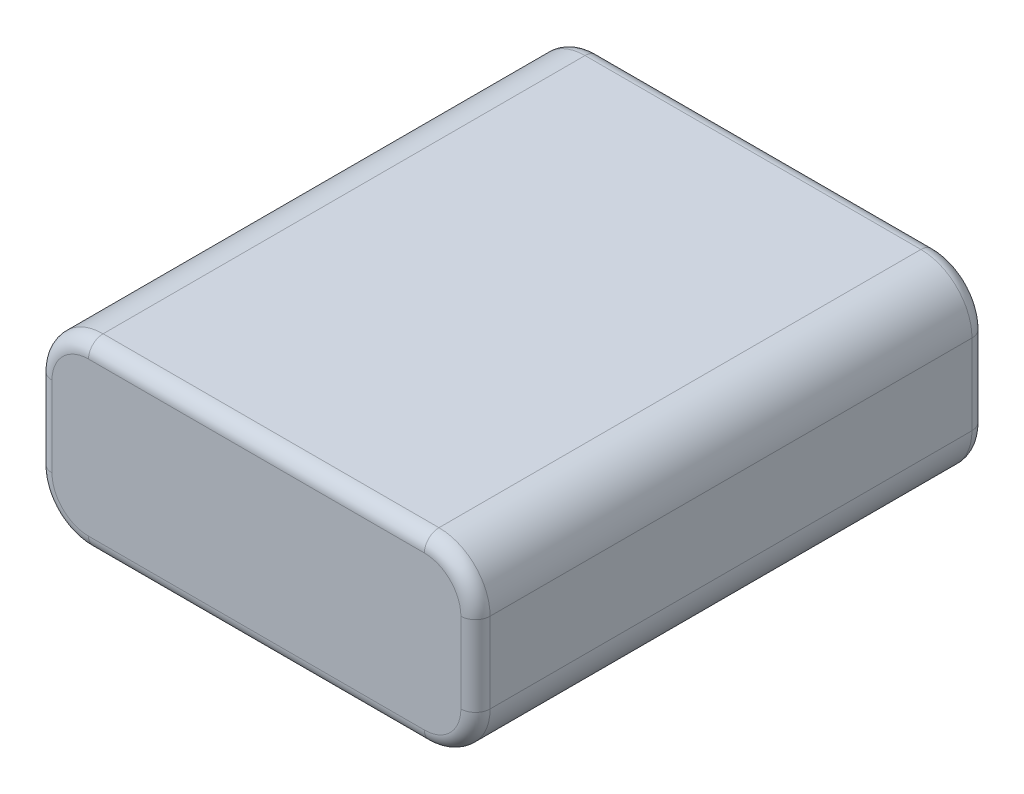
ISO-10303-21;
HEADER;
FILE_DESCRIPTION(('STEP AP214'),'2;1');
FILE_NAME('part.step','',(''),(''),'','','');
FILE_SCHEMA(('AUTOMOTIVE_DESIGN { 1 0 10303 214 1 1 1 1 }'));
ENDSEC;
DATA;
#1=APPLICATION_CONTEXT('core data for automotive mechanical design processes');
#2=APPLICATION_PROTOCOL_DEFINITION('international standard','automotive_design',2000,#1);
#3=PRODUCT_CONTEXT('',#1,'mechanical');
#4=PRODUCT('Part','Part','',(#3));
#5=PRODUCT_RELATED_PRODUCT_CATEGORY('part','',(#4));
#6=PRODUCT_DEFINITION_FORMATION('','',#4);
#7=PRODUCT_DEFINITION_CONTEXT('part definition',#1,'design');
#8=PRODUCT_DEFINITION('design','',#6,#7);
#9=PRODUCT_DEFINITION_SHAPE('','',#8);
#10=(LENGTH_UNIT() NAMED_UNIT(*) SI_UNIT(.MILLI.,.METRE.));
#11=(NAMED_UNIT(*) PLANE_ANGLE_UNIT() SI_UNIT($,.RADIAN.));
#12=(NAMED_UNIT(*) SI_UNIT($,.STERADIAN.) SOLID_ANGLE_UNIT());
#13=UNCERTAINTY_MEASURE_WITH_UNIT(LENGTH_MEASURE(1.E-05),#10,'distance_accuracy_value','');
#14=(GEOMETRIC_REPRESENTATION_CONTEXT(3) GLOBAL_UNCERTAINTY_ASSIGNED_CONTEXT((#13)) GLOBAL_UNIT_ASSIGNED_CONTEXT((#10,
#11,#12)) REPRESENTATION_CONTEXT('',''));
#15=CARTESIAN_POINT('',(0.,0.,0.));
#16=DIRECTION('',(0.,0.,1.));
#17=DIRECTION('',(1.,0.,0.));
#18=AXIS2_PLACEMENT_3D('',#15,#16,#17);
#19=CARTESIAN_POINT('',(53.,18.,70.));
#20=DIRECTION('',(0.,0.,-1.));
#21=DIRECTION('',(-1.,0.,0.));
#22=AXIS2_PLACEMENT_3D('',#19,#20,#21);
#23=CYLINDRICAL_SURFACE('',#22,7.);
#24=DIRECTION('',(0.,0.,-1.));
#25=VECTOR('',#24,1.);
#26=CARTESIAN_POINT('',(60.,18.,70.));
#27=LINE('',#26,#25);
#28=CARTESIAN_POINT('',(60.,18.,68.));
#29=VERTEX_POINT('',#28);
#30=CARTESIAN_POINT('',(60.,18.,2.));
#31=VERTEX_POINT('',#30);
#32=EDGE_CURVE('E320',#29,#31,#27,.T.);
#33=ORIENTED_EDGE('',*,*,#32,.T.);
#34=CARTESIAN_POINT('',(53.,18.,2.));
#35=DIRECTION('',(0.,0.,-1.));
#36=DIRECTION('',(-1.,0.,0.));
#37=AXIS2_PLACEMENT_3D('',#34,#35,#36);
#38=CIRCLE('',#37,7.);
#39=CARTESIAN_POINT('',(53.,25.,2.));
#40=VERTEX_POINT('',#39);
#41=EDGE_CURVE('E269',#31,#40,#38,.F.);
#42=ORIENTED_EDGE('',*,*,#41,.T.);
#43=DIRECTION('',(0.,0.,-1.));
#44=VECTOR('',#43,1.);
#45=CARTESIAN_POINT('',(53.,25.,70.));
#46=LINE('',#45,#44);
#47=CARTESIAN_POINT('',(53.,25.,68.));
#48=VERTEX_POINT('',#47);
#49=EDGE_CURVE('E184',#48,#40,#46,.T.);
#50=ORIENTED_EDGE('',*,*,#49,.F.);
#51=CARTESIAN_POINT('',(53.,18.,68.));
#52=DIRECTION('',(0.,0.,-1.));
#53=DIRECTION('',(-1.,0.,0.));
#54=AXIS2_PLACEMENT_3D('',#51,#52,#53);
#55=CIRCLE('',#54,7.);
#56=EDGE_CURVE('E266',#48,#29,#55,.T.);
#57=ORIENTED_EDGE('',*,*,#56,.T.);
#58=EDGE_LOOP('',(#33,#42,#50,#57));
#59=FACE_BOUND('',#58,.T.);
#60=ADVANCED_FACE('F45',(#59),#23,.T.);
#61=CARTESIAN_POINT('',(7.00000000000005,25.,70.));
#62=DIRECTION('',(0.,-1.,0.));
#63=DIRECTION('',(0.,0.,-1.));
#64=AXIS2_PLACEMENT_3D('',#61,#62,#63);
#65=PLANE('',#64);
#66=ORIENTED_EDGE('',*,*,#49,.T.);
#67=DIRECTION('',(-1.,0.,0.));
#68=VECTOR('',#67,1.);
#69=CARTESIAN_POINT('',(7.00000000000005,25.,2.));
#70=LINE('',#69,#68);
#71=CARTESIAN_POINT('',(7.00000000000005,25.,2.));
#72=VERTEX_POINT('',#71);
#73=EDGE_CURVE('E182',#40,#72,#70,.T.);
#74=ORIENTED_EDGE('',*,*,#73,.T.);
#75=DIRECTION('',(0.,0.,-1.));
#76=VECTOR('',#75,1.);
#77=CARTESIAN_POINT('',(7.00000000000005,25.,70.));
#78=LINE('',#77,#76);
#79=CARTESIAN_POINT('',(7.00000000000005,25.,68.));
#80=VERTEX_POINT('',#79);
#81=EDGE_CURVE('E163',#80,#72,#78,.T.);
#82=ORIENTED_EDGE('',*,*,#81,.F.);
#83=DIRECTION('',(-1.,0.,0.));
#84=VECTOR('',#83,1.);
#85=CARTESIAN_POINT('',(7.00000000000005,25.,68.));
#86=LINE('',#85,#84);
#87=EDGE_CURVE('E179',#80,#48,#86,.F.);
#88=ORIENTED_EDGE('',*,*,#87,.T.);
#89=EDGE_LOOP('',(#66,#74,#82,#88));
#90=FACE_BOUND('',#89,.T.);
#91=ADVANCED_FACE('F177',(#90),#65,.F.);
#92=CARTESIAN_POINT('',(7.,18.,70.));
#93=DIRECTION('',(0.,0.,-1.));
#94=DIRECTION('',(-1.,0.,0.));
#95=AXIS2_PLACEMENT_3D('',#92,#93,#94);
#96=CYLINDRICAL_SURFACE('',#95,7.);
#97=ORIENTED_EDGE('',*,*,#81,.T.);
#98=CARTESIAN_POINT('',(7.,18.,2.));
#99=DIRECTION('',(0.,0.,-1.));
#100=DIRECTION('',(-1.,0.,0.));
#101=AXIS2_PLACEMENT_3D('',#98,#99,#100);
#102=CIRCLE('',#101,7.);
#103=CARTESIAN_POINT('',(0.,18.,2.));
#104=VERTEX_POINT('',#103);
#105=EDGE_CURVE('E171',#72,#104,#102,.F.);
#106=ORIENTED_EDGE('',*,*,#105,.T.);
#107=DIRECTION('',(0.,0.,-1.));
#108=VECTOR('',#107,1.);
#109=CARTESIAN_POINT('',(0.,18.,70.));
#110=LINE('',#109,#108);
#111=CARTESIAN_POINT('',(0.,18.,68.));
#112=VERTEX_POINT('',#111);
#113=EDGE_CURVE('E165',#112,#104,#110,.T.);
#114=ORIENTED_EDGE('',*,*,#113,.F.);
#115=CARTESIAN_POINT('',(7.,18.,68.));
#116=DIRECTION('',(0.,0.,-1.));
#117=DIRECTION('',(-1.,0.,0.));
#118=AXIS2_PLACEMENT_3D('',#115,#116,#117);
#119=CIRCLE('',#118,7.);
#120=EDGE_CURVE('E160',#112,#80,#119,.T.);
#121=ORIENTED_EDGE('',*,*,#120,.T.);
#122=EDGE_LOOP('',(#97,#106,#114,#121));
#123=FACE_BOUND('',#122,.T.);
#124=ADVANCED_FACE('F162',(#123),#96,.T.);
#125=CARTESIAN_POINT('',(0.,7.00000000000005,70.));
#126=DIRECTION('',(1.,0.,0.));
#127=DIRECTION('',(0.,0.,-1.));
#128=AXIS2_PLACEMENT_3D('',#125,#126,#127);
#129=PLANE('',#128);
#130=ORIENTED_EDGE('',*,*,#113,.T.);
#131=DIRECTION('',(0.,-1.,0.));
#132=VECTOR('',#131,1.);
#133=CARTESIAN_POINT('',(0.,7.00000000000005,2.));
#134=LINE('',#133,#132);
#135=CARTESIAN_POINT('',(0.,7.00000000000005,2.));
#136=VERTEX_POINT('',#135);
#137=EDGE_CURVE('E238',#104,#136,#134,.T.);
#138=ORIENTED_EDGE('',*,*,#137,.T.);
#139=DIRECTION('',(0.,0.,-1.));
#140=VECTOR('',#139,1.);
#141=CARTESIAN_POINT('',(0.,7.00000000000005,70.));
#142=LINE('',#141,#140);
#143=CARTESIAN_POINT('',(0.,7.00000000000005,68.));
#144=VERTEX_POINT('',#143);
#145=EDGE_CURVE('E352',#144,#136,#142,.T.);
#146=ORIENTED_EDGE('',*,*,#145,.F.);
#147=DIRECTION('',(0.,-1.,0.));
#148=VECTOR('',#147,1.);
#149=CARTESIAN_POINT('',(0.,7.00000000000005,68.));
#150=LINE('',#149,#148);
#151=EDGE_CURVE('E235',#144,#112,#150,.F.);
#152=ORIENTED_EDGE('',*,*,#151,.T.);
#153=EDGE_LOOP('',(#130,#138,#146,#152));
#154=FACE_BOUND('',#153,.T.);
#155=ADVANCED_FACE('F349',(#154),#129,.F.);
#156=CARTESIAN_POINT('',(7.,7.,70.));
#157=DIRECTION('',(0.,0.,-1.));
#158=DIRECTION('',(-1.,0.,0.));
#159=AXIS2_PLACEMENT_3D('',#156,#157,#158);
#160=CYLINDRICAL_SURFACE('',#159,7.);
#161=ORIENTED_EDGE('',*,*,#145,.T.);
#162=CARTESIAN_POINT('',(7.,7.,2.));
#163=DIRECTION('',(0.,0.,-1.));
#164=DIRECTION('',(-1.,0.,0.));
#165=AXIS2_PLACEMENT_3D('',#162,#163,#164);
#166=CIRCLE('',#165,7.);
#167=CARTESIAN_POINT('',(7.00000000000005,0.,2.));
#168=VERTEX_POINT('',#167);
#169=EDGE_CURVE('E244',#136,#168,#166,.F.);
#170=ORIENTED_EDGE('',*,*,#169,.T.);
#171=DIRECTION('',(0.,0.,-1.));
#172=VECTOR('',#171,1.);
#173=CARTESIAN_POINT('',(7.00000000000005,0.,70.));
#174=LINE('',#173,#172);
#175=CARTESIAN_POINT('',(7.00000000000005,0.,68.));
#176=VERTEX_POINT('',#175);
#177=EDGE_CURVE('E356',#176,#168,#174,.T.);
#178=ORIENTED_EDGE('',*,*,#177,.F.);
#179=CARTESIAN_POINT('',(7.,7.,68.));
#180=DIRECTION('',(0.,0.,-1.));
#181=DIRECTION('',(-1.,0.,0.));
#182=AXIS2_PLACEMENT_3D('',#179,#180,#181);
#183=CIRCLE('',#182,7.);
#184=EDGE_CURVE('E241',#176,#144,#183,.T.);
#185=ORIENTED_EDGE('',*,*,#184,.T.);
#186=EDGE_LOOP('',(#161,#170,#178,#185));
#187=FACE_BOUND('',#186,.T.);
#188=ADVANCED_FACE('F406',(#187),#160,.T.);
#189=CARTESIAN_POINT('',(7.00000000000005,0.,70.));
#190=DIRECTION('',(0.,1.,0.));
#191=DIRECTION('',(0.,0.,1.));
#192=AXIS2_PLACEMENT_3D('',#189,#190,#191);
#193=PLANE('',#192);
#194=ORIENTED_EDGE('',*,*,#177,.T.);
#195=DIRECTION('',(1.,0.,0.));
#196=VECTOR('',#195,1.);
#197=CARTESIAN_POINT('',(53.,0.,2.));
#198=LINE('',#197,#196);
#199=CARTESIAN_POINT('',(53.,0.,2.));
#200=VERTEX_POINT('',#199);
#201=EDGE_CURVE('E250',#168,#200,#198,.T.);
#202=ORIENTED_EDGE('',*,*,#201,.T.);
#203=DIRECTION('',(0.,0.,-1.));
#204=VECTOR('',#203,1.);
#205=CARTESIAN_POINT('',(53.,0.,70.));
#206=LINE('',#205,#204);
#207=CARTESIAN_POINT('',(53.,0.,68.));
#208=VERTEX_POINT('',#207);
#209=EDGE_CURVE('E362',#208,#200,#206,.T.);
#210=ORIENTED_EDGE('',*,*,#209,.F.);
#211=DIRECTION('',(1.,0.,0.));
#212=VECTOR('',#211,1.);
#213=CARTESIAN_POINT('',(7.00000000000005,0.,68.));
#214=LINE('',#213,#212);
#215=EDGE_CURVE('E247',#208,#176,#214,.F.);
#216=ORIENTED_EDGE('',*,*,#215,.T.);
#217=EDGE_LOOP('',(#194,#202,#210,#216));
#218=FACE_BOUND('',#217,.T.);
#219=ADVANCED_FACE('F409',(#218),#193,.F.);
#220=CARTESIAN_POINT('',(53.,7.,70.));
#221=DIRECTION('',(0.,0.,-1.));
#222=DIRECTION('',(-1.,0.,0.));
#223=AXIS2_PLACEMENT_3D('',#220,#221,#222);
#224=CYLINDRICAL_SURFACE('',#223,7.);
#225=ORIENTED_EDGE('',*,*,#209,.T.);
#226=CARTESIAN_POINT('',(53.,7.,2.));
#227=DIRECTION('',(0.,0.,-1.));
#228=DIRECTION('',(-1.,0.,0.));
#229=AXIS2_PLACEMENT_3D('',#226,#227,#228);
#230=CIRCLE('',#229,7.);
#231=CARTESIAN_POINT('',(60.,7.,2.));
#232=VERTEX_POINT('',#231);
#233=EDGE_CURVE('E256',#200,#232,#230,.F.);
#234=ORIENTED_EDGE('',*,*,#233,.T.);
#235=DIRECTION('',(0.,0.,-1.));
#236=VECTOR('',#235,1.);
#237=CARTESIAN_POINT('',(60.,7.,70.));
#238=LINE('',#237,#236);
#239=CARTESIAN_POINT('',(60.,7.,68.));
#240=VERTEX_POINT('',#239);
#241=EDGE_CURVE('E368',#240,#232,#238,.T.);
#242=ORIENTED_EDGE('',*,*,#241,.F.);
#243=CARTESIAN_POINT('',(53.,7.,68.));
#244=DIRECTION('',(0.,0.,-1.));
#245=DIRECTION('',(-1.,0.,0.));
#246=AXIS2_PLACEMENT_3D('',#243,#244,#245);
#247=CIRCLE('',#246,7.);
#248=EDGE_CURVE('E253',#240,#208,#247,.T.);
#249=ORIENTED_EDGE('',*,*,#248,.T.);
#250=EDGE_LOOP('',(#225,#234,#242,#249));
#251=FACE_BOUND('',#250,.T.);
#252=ADVANCED_FACE('F423',(#251),#224,.T.);
#253=CARTESIAN_POINT('',(60.,7.00000000000005,70.));
#254=DIRECTION('',(-1.,0.,0.));
#255=DIRECTION('',(0.,0.,1.));
#256=AXIS2_PLACEMENT_3D('',#253,#254,#255);
#257=PLANE('',#256);
#258=ORIENTED_EDGE('',*,*,#241,.T.);
#259=DIRECTION('',(0.,1.,0.));
#260=VECTOR('',#259,1.);
#261=CARTESIAN_POINT('',(60.,18.,2.));
#262=LINE('',#261,#260);
#263=EDGE_CURVE('E263',#232,#31,#262,.T.);
#264=ORIENTED_EDGE('',*,*,#263,.T.);
#265=ORIENTED_EDGE('',*,*,#32,.F.);
#266=DIRECTION('',(0.,1.,0.));
#267=VECTOR('',#266,1.);
#268=CARTESIAN_POINT('',(60.,7.00000000000005,68.));
#269=LINE('',#268,#267);
#270=EDGE_CURVE('E259',#29,#240,#269,.F.);
#271=ORIENTED_EDGE('',*,*,#270,.T.);
#272=EDGE_LOOP('',(#258,#264,#265,#271));
#273=FACE_BOUND('',#272,.T.);
#274=ADVANCED_FACE('F424',(#273),#257,.F.);
#275=CARTESIAN_POINT('',(53.,18.,70.));
#276=DIRECTION('',(0.,0.,-1.));
#277=DIRECTION('',(-1.,0.,0.));
#278=AXIS2_PLACEMENT_3D('',#275,#276,#277);
#279=PLANE('',#278);
#280=CARTESIAN_POINT('',(53.,7.,70.));
#281=DIRECTION('',(0.,0.,-1.));
#282=DIRECTION('',(-1.,0.,0.));
#283=AXIS2_PLACEMENT_3D('',#280,#281,#282);
#284=CIRCLE('',#283,5.);
#285=CARTESIAN_POINT('',(53.,2.,70.));
#286=VERTEX_POINT('',#285);
#287=CARTESIAN_POINT('',(58.,7.,70.));
#288=VERTEX_POINT('',#287);
#289=EDGE_CURVE('E55',#286,#288,#284,.F.);
#290=ORIENTED_EDGE('',*,*,#289,.T.);
#291=DIRECTION('',(0.,1.,0.));
#292=VECTOR('',#291,1.);
#293=CARTESIAN_POINT('',(58.,18.,70.));
#294=LINE('',#293,#292);
#295=CARTESIAN_POINT('',(58.,18.,70.));
#296=VERTEX_POINT('',#295);
#297=EDGE_CURVE('E11',#288,#296,#294,.T.);
#298=ORIENTED_EDGE('',*,*,#297,.T.);
#299=CARTESIAN_POINT('',(53.,18.,70.));
#300=DIRECTION('',(0.,0.,-1.));
#301=DIRECTION('',(-1.,0.,0.));
#302=AXIS2_PLACEMENT_3D('',#299,#300,#301);
#303=CIRCLE('',#302,5.);
#304=CARTESIAN_POINT('',(53.,23.,70.));
#305=VERTEX_POINT('',#304);
#306=EDGE_CURVE('E272',#296,#305,#303,.F.);
#307=ORIENTED_EDGE('',*,*,#306,.T.);
#308=DIRECTION('',(-1.,0.,0.));
#309=VECTOR('',#308,1.);
#310=CARTESIAN_POINT('',(53.,23.,70.));
#311=LINE('',#310,#309);
#312=CARTESIAN_POINT('',(7.00000000000003,23.,70.));
#313=VERTEX_POINT('',#312);
#314=EDGE_CURVE('E275',#305,#313,#311,.T.);
#315=ORIENTED_EDGE('',*,*,#314,.T.);
#316=CARTESIAN_POINT('',(7.,18.,70.));
#317=DIRECTION('',(0.,0.,-1.));
#318=DIRECTION('',(-1.,0.,0.));
#319=AXIS2_PLACEMENT_3D('',#316,#317,#318);
#320=CIRCLE('',#319,5.);
#321=CARTESIAN_POINT('',(2.,18.,70.));
#322=VERTEX_POINT('',#321);
#323=EDGE_CURVE('E190',#313,#322,#320,.F.);
#324=ORIENTED_EDGE('',*,*,#323,.T.);
#325=DIRECTION('',(0.,-1.,0.));
#326=VECTOR('',#325,1.);
#327=CARTESIAN_POINT('',(2.,18.,70.));
#328=LINE('',#327,#326);
#329=CARTESIAN_POINT('',(2.,7.00000000000003,70.));
#330=VERTEX_POINT('',#329);
#331=EDGE_CURVE('E280',#322,#330,#328,.T.);
#332=ORIENTED_EDGE('',*,*,#331,.T.);
#333=CARTESIAN_POINT('',(7.,7.,70.));
#334=DIRECTION('',(0.,0.,-1.));
#335=DIRECTION('',(-1.,0.,0.));
#336=AXIS2_PLACEMENT_3D('',#333,#334,#335);
#337=CIRCLE('',#336,5.);
#338=CARTESIAN_POINT('',(7.00000000000005,2.,70.));
#339=VERTEX_POINT('',#338);
#340=EDGE_CURVE('E283',#330,#339,#337,.F.);
#341=ORIENTED_EDGE('',*,*,#340,.T.);
#342=DIRECTION('',(1.,0.,0.));
#343=VECTOR('',#342,1.);
#344=CARTESIAN_POINT('',(53.,2.,70.));
#345=LINE('',#344,#343);
#346=EDGE_CURVE('E66',#339,#286,#345,.T.);
#347=ORIENTED_EDGE('',*,*,#346,.T.);
#348=EDGE_LOOP('',(#290,#298,#307,#315,#324,#332,#341,#347));
#349=FACE_BOUND('',#348,.T.);
#350=ADVANCED_FACE('F433',(#349),#279,.F.);
#351=CARTESIAN_POINT('',(53.,18.,0.));
#352=DIRECTION('',(0.,0.,-1.));
#353=DIRECTION('',(-1.,0.,0.));
#354=AXIS2_PLACEMENT_3D('',#351,#352,#353);
#355=PLANE('',#354);
#356=CARTESIAN_POINT('',(7.,18.,0.));
#357=DIRECTION('',(0.,0.,-1.));
#358=DIRECTION('',(-1.,0.,0.));
#359=AXIS2_PLACEMENT_3D('',#356,#357,#358);
#360=CIRCLE('',#359,5.);
#361=CARTESIAN_POINT('',(2.,18.,0.));
#362=VERTEX_POINT('',#361);
#363=CARTESIAN_POINT('',(7.00000000000005,23.,0.));
#364=VERTEX_POINT('',#363);
#365=EDGE_CURVE('E227',#362,#364,#360,.T.);
#366=ORIENTED_EDGE('',*,*,#365,.T.);
#367=DIRECTION('',(-1.,0.,0.));
#368=VECTOR('',#367,1.);
#369=CARTESIAN_POINT('',(53.,23.,0.));
#370=LINE('',#369,#368);
#371=CARTESIAN_POINT('',(53.,23.,0.));
#372=VERTEX_POINT('',#371);
#373=EDGE_CURVE('E172',#364,#372,#370,.F.);
#374=ORIENTED_EDGE('',*,*,#373,.T.);
#375=CARTESIAN_POINT('',(53.,18.,0.));
#376=DIRECTION('',(0.,0.,-1.));
#377=DIRECTION('',(-1.,0.,0.));
#378=AXIS2_PLACEMENT_3D('',#375,#376,#377);
#379=CIRCLE('',#378,5.);
#380=CARTESIAN_POINT('',(58.,18.,0.));
#381=VERTEX_POINT('',#380);
#382=EDGE_CURVE('E206',#372,#381,#379,.T.);
#383=ORIENTED_EDGE('',*,*,#382,.T.);
#384=DIRECTION('',(0.,1.,0.));
#385=VECTOR('',#384,1.);
#386=CARTESIAN_POINT('',(58.,7.,0.));
#387=LINE('',#386,#385);
#388=CARTESIAN_POINT('',(58.,7.,0.));
#389=VERTEX_POINT('',#388);
#390=EDGE_CURVE('E212',#381,#389,#387,.F.);
#391=ORIENTED_EDGE('',*,*,#390,.T.);
#392=CARTESIAN_POINT('',(53.,7.,0.));
#393=DIRECTION('',(0.,0.,-1.));
#394=DIRECTION('',(-1.,0.,0.));
#395=AXIS2_PLACEMENT_3D('',#392,#393,#394);
#396=CIRCLE('',#395,5.);
#397=CARTESIAN_POINT('',(53.,2.,0.));
#398=VERTEX_POINT('',#397);
#399=EDGE_CURVE('E215',#389,#398,#396,.T.);
#400=ORIENTED_EDGE('',*,*,#399,.T.);
#401=DIRECTION('',(1.,0.,0.));
#402=VECTOR('',#401,1.);
#403=CARTESIAN_POINT('',(7.00000000000005,2.,0.));
#404=LINE('',#403,#402);
#405=CARTESIAN_POINT('',(7.00000000000004,2.,0.));
#406=VERTEX_POINT('',#405);
#407=EDGE_CURVE('E218',#398,#406,#404,.F.);
#408=ORIENTED_EDGE('',*,*,#407,.T.);
#409=CARTESIAN_POINT('',(7.,7.,0.));
#410=DIRECTION('',(0.,0.,-1.));
#411=DIRECTION('',(-1.,0.,0.));
#412=AXIS2_PLACEMENT_3D('',#409,#410,#411);
#413=CIRCLE('',#412,5.);
#414=CARTESIAN_POINT('',(2.,7.00000000000005,0.));
#415=VERTEX_POINT('',#414);
#416=EDGE_CURVE('E221',#406,#415,#413,.T.);
#417=ORIENTED_EDGE('',*,*,#416,.T.);
#418=DIRECTION('',(0.,-1.,0.));
#419=VECTOR('',#418,1.);
#420=CARTESIAN_POINT('',(2.,18.,0.));
#421=LINE('',#420,#419);
#422=EDGE_CURVE('E224',#415,#362,#421,.F.);
#423=ORIENTED_EDGE('',*,*,#422,.T.);
#424=EDGE_LOOP('',(#366,#374,#383,#391,#400,#408,#417,#423));
#425=FACE_BOUND('',#424,.T.);
#426=ADVANCED_FACE('F435',(#425),#355,.T.);
#427=CARTESIAN_POINT('',(7.00000000000005,2.,2.));
#428=DIRECTION('',(-1.,0.,0.));
#429=DIRECTION('',(0.,0.,1.));
#430=AXIS2_PLACEMENT_3D('',#427,#428,#429);
#431=CYLINDRICAL_SURFACE('',#430,2.);
#432=CARTESIAN_POINT('',(7.00000000000004,2.,2.));
#433=DIRECTION('',(-1.,0.,0.));
#434=DIRECTION('',(0.,-1.,0.));
#435=AXIS2_PLACEMENT_3D('',#432,#433,#434);
#436=CIRCLE('',#435,2.);
#437=EDGE_CURVE('E312',#406,#168,#436,.T.);
#438=ORIENTED_EDGE('',*,*,#437,.F.);
#439=ORIENTED_EDGE('',*,*,#407,.F.);
#440=CARTESIAN_POINT('',(53.,2.,2.));
#441=DIRECTION('',(1.,0.,0.));
#442=DIRECTION('',(0.,0.,-1.));
#443=AXIS2_PLACEMENT_3D('',#440,#441,#442);
#444=CIRCLE('',#443,2.);
#445=EDGE_CURVE('E316',#200,#398,#444,.T.);
#446=ORIENTED_EDGE('',*,*,#445,.F.);
#447=ORIENTED_EDGE('',*,*,#201,.F.);
#448=EDGE_LOOP('',(#438,#439,#446,#447));
#449=FACE_BOUND('',#448,.T.);
#450=ADVANCED_FACE('F414',(#449),#431,.T.);
#451=CARTESIAN_POINT('',(53.,7.,2.));
#452=DIRECTION('',(0.,0.,-1.));
#453=DIRECTION('',(-1.,0.,0.));
#454=AXIS2_PLACEMENT_3D('',#451,#452,#453);
#455=TOROIDAL_SURFACE('',#454,5.,2.);
#456=ORIENTED_EDGE('',*,*,#445,.T.);
#457=ORIENTED_EDGE('',*,*,#399,.F.);
#458=CARTESIAN_POINT('',(58.,7.,2.));
#459=DIRECTION('',(0.,1.,0.));
#460=DIRECTION('',(0.,0.,1.));
#461=AXIS2_PLACEMENT_3D('',#458,#459,#460);
#462=CIRCLE('',#461,2.);
#463=EDGE_CURVE('E308',#232,#389,#462,.T.);
#464=ORIENTED_EDGE('',*,*,#463,.F.);
#465=ORIENTED_EDGE('',*,*,#233,.F.);
#466=EDGE_LOOP('',(#456,#457,#464,#465));
#467=FACE_BOUND('',#466,.T.);
#468=ADVANCED_FACE('F420',(#467),#455,.T.);
#469=CARTESIAN_POINT('',(7.,7.,2.));
#470=DIRECTION('',(0.,0.,-1.));
#471=DIRECTION('',(-1.,0.,0.));
#472=AXIS2_PLACEMENT_3D('',#469,#470,#471);
#473=TOROIDAL_SURFACE('',#472,5.,2.);
#474=ORIENTED_EDGE('',*,*,#437,.T.);
#475=ORIENTED_EDGE('',*,*,#169,.F.);
#476=CARTESIAN_POINT('',(2.,7.00000000000005,2.));
#477=DIRECTION('',(0.,1.,0.));
#478=DIRECTION('',(0.,0.,1.));
#479=AXIS2_PLACEMENT_3D('',#476,#477,#478);
#480=CIRCLE('',#479,2.);
#481=EDGE_CURVE('E304',#415,#136,#480,.T.);
#482=ORIENTED_EDGE('',*,*,#481,.F.);
#483=ORIENTED_EDGE('',*,*,#416,.F.);
#484=EDGE_LOOP('',(#474,#475,#482,#483));
#485=FACE_BOUND('',#484,.T.);
#486=ADVANCED_FACE('F403',(#485),#473,.T.);
#487=CARTESIAN_POINT('',(58.,7.00000000000005,2.));
#488=DIRECTION('',(0.,-1.,0.));
#489=DIRECTION('',(0.,0.,-1.));
#490=AXIS2_PLACEMENT_3D('',#487,#488,#489);
#491=CYLINDRICAL_SURFACE('',#490,2.);
#492=ORIENTED_EDGE('',*,*,#463,.T.);
#493=ORIENTED_EDGE('',*,*,#390,.F.);
#494=CARTESIAN_POINT('',(58.,18.,2.));
#495=DIRECTION('',(0.,1.,0.));
#496=DIRECTION('',(0.,0.,1.));
#497=AXIS2_PLACEMENT_3D('',#494,#495,#496);
#498=CIRCLE('',#497,2.);
#499=EDGE_CURVE('E300',#31,#381,#498,.T.);
#500=ORIENTED_EDGE('',*,*,#499,.F.);
#501=ORIENTED_EDGE('',*,*,#263,.F.);
#502=EDGE_LOOP('',(#492,#493,#500,#501));
#503=FACE_BOUND('',#502,.T.);
#504=ADVANCED_FACE('F383',(#503),#491,.T.);
#505=CARTESIAN_POINT('',(2.,7.00000000000005,2.));
#506=DIRECTION('',(0.,1.,0.));
#507=DIRECTION('',(0.,0.,1.));
#508=AXIS2_PLACEMENT_3D('',#505,#506,#507);
#509=CYLINDRICAL_SURFACE('',#508,2.);
#510=ORIENTED_EDGE('',*,*,#481,.T.);
#511=ORIENTED_EDGE('',*,*,#137,.F.);
#512=CARTESIAN_POINT('',(2.,18.,2.));
#513=DIRECTION('',(0.,1.,0.));
#514=DIRECTION('',(-1.,0.,0.));
#515=AXIS2_PLACEMENT_3D('',#512,#513,#514);
#516=CIRCLE('',#515,2.);
#517=EDGE_CURVE('E296',#362,#104,#516,.T.);
#518=ORIENTED_EDGE('',*,*,#517,.F.);
#519=ORIENTED_EDGE('',*,*,#422,.F.);
#520=EDGE_LOOP('',(#510,#511,#518,#519));
#521=FACE_BOUND('',#520,.T.);
#522=ADVANCED_FACE('F399',(#521),#509,.T.);
#523=CARTESIAN_POINT('',(53.,18.,2.));
#524=DIRECTION('',(0.,0.,-1.));
#525=DIRECTION('',(-1.,0.,0.));
#526=AXIS2_PLACEMENT_3D('',#523,#524,#525);
#527=TOROIDAL_SURFACE('',#526,5.,2.);
#528=ORIENTED_EDGE('',*,*,#499,.T.);
#529=ORIENTED_EDGE('',*,*,#382,.F.);
#530=CARTESIAN_POINT('',(53.,23.,2.));
#531=DIRECTION('',(-1.,0.,0.));
#532=DIRECTION('',(0.,0.,1.));
#533=AXIS2_PLACEMENT_3D('',#530,#531,#532);
#534=CIRCLE('',#533,2.);
#535=EDGE_CURVE('E293',#40,#372,#534,.T.);
#536=ORIENTED_EDGE('',*,*,#535,.F.);
#537=ORIENTED_EDGE('',*,*,#41,.F.);
#538=EDGE_LOOP('',(#528,#529,#536,#537));
#539=FACE_BOUND('',#538,.T.);
#540=ADVANCED_FACE('F387',(#539),#527,.T.);
#541=CARTESIAN_POINT('',(7.,18.,2.));
#542=DIRECTION('',(0.,0.,-1.));
#543=DIRECTION('',(-1.,0.,0.));
#544=AXIS2_PLACEMENT_3D('',#541,#542,#543);
#545=TOROIDAL_SURFACE('',#544,5.,2.);
#546=ORIENTED_EDGE('',*,*,#517,.T.);
#547=ORIENTED_EDGE('',*,*,#105,.F.);
#548=CARTESIAN_POINT('',(7.00000000000005,23.,2.));
#549=DIRECTION('',(1.,0.,0.));
#550=DIRECTION('',(0.,0.,-1.));
#551=AXIS2_PLACEMENT_3D('',#548,#549,#550);
#552=CIRCLE('',#551,2.);
#553=EDGE_CURVE('E290',#364,#72,#552,.T.);
#554=ORIENTED_EDGE('',*,*,#553,.F.);
#555=ORIENTED_EDGE('',*,*,#365,.F.);
#556=EDGE_LOOP('',(#546,#547,#554,#555));
#557=FACE_BOUND('',#556,.T.);
#558=ADVANCED_FACE('F395',(#557),#545,.T.);
#559=CARTESIAN_POINT('',(7.00000000000005,23.,2.));
#560=DIRECTION('',(1.,0.,0.));
#561=DIRECTION('',(0.,0.,-1.));
#562=AXIS2_PLACEMENT_3D('',#559,#560,#561);
#563=CYLINDRICAL_SURFACE('',#562,2.);
#564=ORIENTED_EDGE('',*,*,#535,.T.);
#565=ORIENTED_EDGE('',*,*,#373,.F.);
#566=ORIENTED_EDGE('',*,*,#553,.T.);
#567=ORIENTED_EDGE('',*,*,#73,.F.);
#568=EDGE_LOOP('',(#564,#565,#566,#567));
#569=FACE_BOUND('',#568,.T.);
#570=ADVANCED_FACE('F390',(#569),#563,.T.);
#571=CARTESIAN_POINT('',(2.,18.,68.));
#572=DIRECTION('',(0.,-1.,0.));
#573=DIRECTION('',(0.,0.,-1.));
#574=AXIS2_PLACEMENT_3D('',#571,#572,#573);
#575=CYLINDRICAL_SURFACE('',#574,2.);
#576=CARTESIAN_POINT('',(2.,18.,68.));
#577=DIRECTION('',(0.,1.,0.));
#578=DIRECTION('',(0.,0.,1.));
#579=AXIS2_PLACEMENT_3D('',#576,#577,#578);
#580=CIRCLE('',#579,2.);
#581=EDGE_CURVE('E334',#112,#322,#580,.T.);
#582=ORIENTED_EDGE('',*,*,#581,.F.);
#583=ORIENTED_EDGE('',*,*,#151,.F.);
#584=CARTESIAN_POINT('',(2.,7.00000000000003,68.));
#585=DIRECTION('',(0.,-1.,0.));
#586=DIRECTION('',(1.,0.,0.));
#587=AXIS2_PLACEMENT_3D('',#584,#585,#586);
#588=CIRCLE('',#587,2.);
#589=EDGE_CURVE('E49',#330,#144,#588,.T.);
#590=ORIENTED_EDGE('',*,*,#589,.F.);
#591=ORIENTED_EDGE('',*,*,#331,.F.);
#592=EDGE_LOOP('',(#582,#583,#590,#591));
#593=FACE_BOUND('',#592,.T.);
#594=ADVANCED_FACE('F47',(#593),#575,.T.);
#595=CARTESIAN_POINT('',(7.,7.,68.));
#596=DIRECTION('',(0.,0.,-1.));
#597=DIRECTION('',(-1.,0.,0.));
#598=AXIS2_PLACEMENT_3D('',#595,#596,#597);
#599=TOROIDAL_SURFACE('',#598,5.,2.);
#600=ORIENTED_EDGE('',*,*,#589,.T.);
#601=ORIENTED_EDGE('',*,*,#184,.F.);
#602=CARTESIAN_POINT('',(7.00000000000005,2.,68.));
#603=DIRECTION('',(1.,0.,0.));
#604=DIRECTION('',(0.,0.,-1.));
#605=AXIS2_PLACEMENT_3D('',#602,#603,#604);
#606=CIRCLE('',#605,2.);
#607=EDGE_CURVE('E194',#339,#176,#606,.T.);
#608=ORIENTED_EDGE('',*,*,#607,.F.);
#609=ORIENTED_EDGE('',*,*,#340,.F.);
#610=EDGE_LOOP('',(#600,#601,#608,#609));
#611=FACE_BOUND('',#610,.T.);
#612=ADVANCED_FACE('F342',(#611),#599,.T.);
#613=CARTESIAN_POINT('',(7.,18.,68.));
#614=DIRECTION('',(0.,0.,-1.));
#615=DIRECTION('',(-1.,0.,0.));
#616=AXIS2_PLACEMENT_3D('',#613,#614,#615);
#617=TOROIDAL_SURFACE('',#616,5.,2.);
#618=ORIENTED_EDGE('',*,*,#581,.T.);
#619=ORIENTED_EDGE('',*,*,#323,.F.);
#620=CARTESIAN_POINT('',(7.00000000000003,23.,68.));
#621=DIRECTION('',(1.,0.,0.));
#622=DIRECTION('',(0.,1.,0.));
#623=AXIS2_PLACEMENT_3D('',#620,#621,#622);
#624=CIRCLE('',#623,2.);
#625=EDGE_CURVE('E188',#80,#313,#624,.T.);
#626=ORIENTED_EDGE('',*,*,#625,.F.);
#627=ORIENTED_EDGE('',*,*,#120,.F.);
#628=EDGE_LOOP('',(#618,#619,#626,#627));
#629=FACE_BOUND('',#628,.T.);
#630=ADVANCED_FACE('F189',(#629),#617,.T.);
#631=CARTESIAN_POINT('',(53.,2.,68.));
#632=DIRECTION('',(1.,0.,0.));
#633=DIRECTION('',(0.,0.,-1.));
#634=AXIS2_PLACEMENT_3D('',#631,#632,#633);
#635=CYLINDRICAL_SURFACE('',#634,2.);
#636=ORIENTED_EDGE('',*,*,#607,.T.);
#637=ORIENTED_EDGE('',*,*,#215,.F.);
#638=CARTESIAN_POINT('',(53.,2.,68.));
#639=DIRECTION('',(1.,0.,0.));
#640=DIRECTION('',(0.,1.,0.));
#641=AXIS2_PLACEMENT_3D('',#638,#639,#640);
#642=CIRCLE('',#641,2.);
#643=EDGE_CURVE('E195',#286,#208,#642,.T.);
#644=ORIENTED_EDGE('',*,*,#643,.F.);
#645=ORIENTED_EDGE('',*,*,#346,.F.);
#646=EDGE_LOOP('',(#636,#637,#644,#645));
#647=FACE_BOUND('',#646,.T.);
#648=ADVANCED_FACE('F478',(#647),#635,.T.);
#649=CARTESIAN_POINT('',(53.,23.,68.));
#650=DIRECTION('',(-1.,0.,0.));
#651=DIRECTION('',(0.,0.,1.));
#652=AXIS2_PLACEMENT_3D('',#649,#650,#651);
#653=CYLINDRICAL_SURFACE('',#652,2.);
#654=ORIENTED_EDGE('',*,*,#625,.T.);
#655=ORIENTED_EDGE('',*,*,#314,.F.);
#656=CARTESIAN_POINT('',(53.,23.,68.));
#657=DIRECTION('',(1.,0.,0.));
#658=DIRECTION('',(0.,0.,-1.));
#659=AXIS2_PLACEMENT_3D('',#656,#657,#658);
#660=CIRCLE('',#659,2.);
#661=EDGE_CURVE('E200',#48,#305,#660,.T.);
#662=ORIENTED_EDGE('',*,*,#661,.F.);
#663=ORIENTED_EDGE('',*,*,#87,.F.);
#664=EDGE_LOOP('',(#654,#655,#662,#663));
#665=FACE_BOUND('',#664,.T.);
#666=ADVANCED_FACE('F198',(#665),#653,.T.);
#667=CARTESIAN_POINT('',(53.,7.,68.));
#668=DIRECTION('',(0.,0.,-1.));
#669=DIRECTION('',(-1.,0.,0.));
#670=AXIS2_PLACEMENT_3D('',#667,#668,#669);
#671=TOROIDAL_SURFACE('',#670,5.,2.);
#672=ORIENTED_EDGE('',*,*,#643,.T.);
#673=ORIENTED_EDGE('',*,*,#248,.F.);
#674=CARTESIAN_POINT('',(58.,7.,68.));
#675=DIRECTION('',(0.,1.,0.));
#676=DIRECTION('',(0.,0.,1.));
#677=AXIS2_PLACEMENT_3D('',#674,#675,#676);
#678=CIRCLE('',#677,2.);
#679=EDGE_CURVE('E324',#288,#240,#678,.T.);
#680=ORIENTED_EDGE('',*,*,#679,.F.);
#681=ORIENTED_EDGE('',*,*,#289,.F.);
#682=EDGE_LOOP('',(#672,#673,#680,#681));
#683=FACE_BOUND('',#682,.T.);
#684=ADVANCED_FACE('F472',(#683),#671,.T.);
#685=CARTESIAN_POINT('',(53.,18.,68.));
#686=DIRECTION('',(0.,0.,-1.));
#687=DIRECTION('',(-1.,0.,0.));
#688=AXIS2_PLACEMENT_3D('',#685,#686,#687);
#689=TOROIDAL_SURFACE('',#688,5.,2.);
#690=ORIENTED_EDGE('',*,*,#661,.T.);
#691=ORIENTED_EDGE('',*,*,#306,.F.);
#692=CARTESIAN_POINT('',(58.,18.,68.));
#693=DIRECTION('',(0.,-1.,0.));
#694=DIRECTION('',(0.,0.,-1.));
#695=AXIS2_PLACEMENT_3D('',#692,#693,#694);
#696=CIRCLE('',#695,2.);
#697=EDGE_CURVE('E321',#29,#296,#696,.T.);
#698=ORIENTED_EDGE('',*,*,#697,.F.);
#699=ORIENTED_EDGE('',*,*,#56,.F.);
#700=EDGE_LOOP('',(#690,#691,#698,#699));
#701=FACE_BOUND('',#700,.T.);
#702=ADVANCED_FACE('F432',(#701),#689,.T.);
#703=CARTESIAN_POINT('',(58.,18.,68.));
#704=DIRECTION('',(0.,1.,0.));
#705=DIRECTION('',(0.,0.,1.));
#706=AXIS2_PLACEMENT_3D('',#703,#704,#705);
#707=CYLINDRICAL_SURFACE('',#706,2.);
#708=ORIENTED_EDGE('',*,*,#679,.T.);
#709=ORIENTED_EDGE('',*,*,#270,.F.);
#710=ORIENTED_EDGE('',*,*,#697,.T.);
#711=ORIENTED_EDGE('',*,*,#297,.F.);
#712=EDGE_LOOP('',(#708,#709,#710,#711));
#713=FACE_BOUND('',#712,.T.);
#714=ADVANCED_FACE('F427',(#713),#707,.T.);
#715=CLOSED_SHELL('',(#60,#91,#124,#155,#188,#219,#252,#274,#350,#426,#450,#468,#486,#504,#522,
#540,#558,#570,#594,#612,#630,#648,#666,#684,#702,#714));
#716=MANIFOLD_SOLID_BREP('B2',#715);
#717=ADVANCED_BREP_SHAPE_REPRESENTATION('',(#18,#716),#14);
#718=SHAPE_DEFINITION_REPRESENTATION(#9,#717);
ENDSEC;
END-ISO-10303-21;
